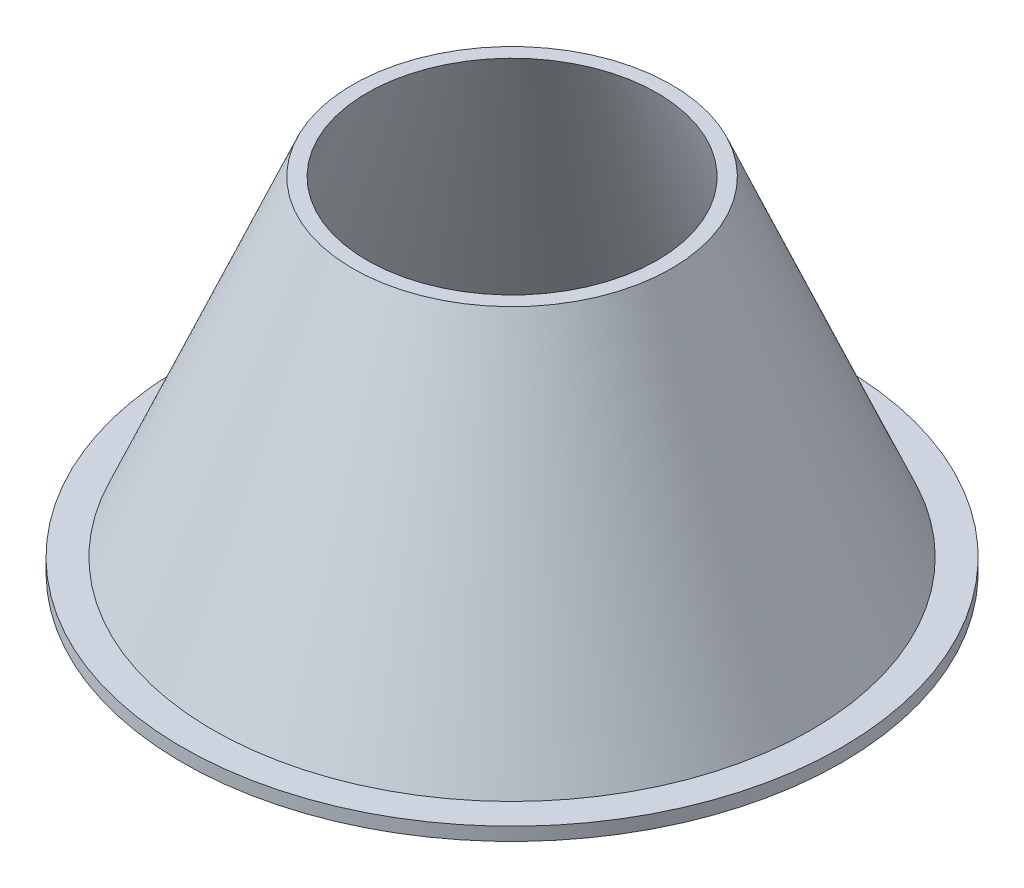
ISO-10303-21;
HEADER;
FILE_DESCRIPTION(('STEP AP214'),'2;1');
FILE_NAME('part.step','',(''),(''),'','','');
FILE_SCHEMA(('AUTOMOTIVE_DESIGN { 1 0 10303 214 1 1 1 1 }'));
ENDSEC;
DATA;
#1=APPLICATION_CONTEXT('core data for automotive mechanical design processes');
#2=APPLICATION_PROTOCOL_DEFINITION('international standard','automotive_design',2000,#1);
#3=PRODUCT_CONTEXT('',#1,'mechanical');
#4=PRODUCT('Part','Part','',(#3));
#5=PRODUCT_RELATED_PRODUCT_CATEGORY('part','',(#4));
#6=PRODUCT_DEFINITION_FORMATION('','',#4);
#7=PRODUCT_DEFINITION_CONTEXT('part definition',#1,'design');
#8=PRODUCT_DEFINITION('design','',#6,#7);
#9=PRODUCT_DEFINITION_SHAPE('','',#8);
#10=(LENGTH_UNIT() NAMED_UNIT(*) SI_UNIT(.MILLI.,.METRE.));
#11=(NAMED_UNIT(*) PLANE_ANGLE_UNIT() SI_UNIT($,.RADIAN.));
#12=(NAMED_UNIT(*) SI_UNIT($,.STERADIAN.) SOLID_ANGLE_UNIT());
#13=UNCERTAINTY_MEASURE_WITH_UNIT(LENGTH_MEASURE(1.E-05),#10,'distance_accuracy_value','');
#14=(GEOMETRIC_REPRESENTATION_CONTEXT(3) GLOBAL_UNCERTAINTY_ASSIGNED_CONTEXT((#13)) GLOBAL_UNIT_ASSIGNED_CONTEXT((#10,
#11,#12)) REPRESENTATION_CONTEXT('',''));
#15=CARTESIAN_POINT('',(0.,0.,0.));
#16=DIRECTION('',(0.,0.,1.));
#17=DIRECTION('',(1.,0.,0.));
#18=AXIS2_PLACEMENT_3D('',#15,#16,#17);
#19=CARTESIAN_POINT('',(-9.21833143574773,-10.8009520520653,0.));
#20=DIRECTION('',(0.,-1.,0.));
#21=DIRECTION('',(0.,0.,-1.));
#22=AXIS2_PLACEMENT_3D('',#19,#20,#21);
#23=PLANE('',#22);
#24=CARTESIAN_POINT('',(-32.7365040464726,-10.8009520545964,0.));
#25=DIRECTION('',(0.,-1.,0.));
#26=DIRECTION('',(1.,0.,0.));
#27=AXIS2_PLACEMENT_3D('',#24,#25,#26);
#28=CIRCLE('',#27,22.0363452154867);
#29=CARTESIAN_POINT('',(-10.7001588309859,-10.8009520545964,0.));
#30=VERTEX_POINT('',#29);
#31=EDGE_CURVE('E41',#30,#30,#28,.F.);
#32=ORIENTED_EDGE('',*,*,#31,.T.);
#33=EDGE_LOOP('',(#32));
#34=FACE_BOUND('',#33,.T.);
#35=CARTESIAN_POINT('',(-32.7365040464726,-10.8009520520653,0.));
#36=DIRECTION('',(0.,-1.,0.));
#37=DIRECTION('',(1.,0.,0.));
#38=AXIS2_PLACEMENT_3D('',#35,#36,#37);
#39=CIRCLE('',#38,25.);
#40=CARTESIAN_POINT('',(-7.73650404647259,-10.8009520520653,0.));
#41=VERTEX_POINT('',#40);
#42=EDGE_CURVE('E46',#41,#41,#39,.F.);
#43=ORIENTED_EDGE('',*,*,#42,.F.);
#44=EDGE_LOOP('',(#43));
#45=FACE_BOUND('',#44,.T.);
#46=ADVANCED_FACE('F15',(#34,#45),#23,.T.);
#47=CARTESIAN_POINT('',(-32.7365040464726,-10.3009520520653,0.));
#48=DIRECTION('',(0.,-1.,0.));
#49=DIRECTION('',(1.,0.,0.));
#50=AXIS2_PLACEMENT_3D('',#47,#48,#49);
#51=CYLINDRICAL_SURFACE('',#50,25.);
#52=CARTESIAN_POINT('',(-32.7365040464726,-9.80095205206527,0.));
#53=DIRECTION('',(0.,-1.,0.));
#54=DIRECTION('',(1.,0.,0.));
#55=AXIS2_PLACEMENT_3D('',#52,#53,#54);
#56=CIRCLE('',#55,25.);
#57=CARTESIAN_POINT('',(-7.73650404647259,-9.80095205206525,0.));
#58=VERTEX_POINT('',#57);
#59=EDGE_CURVE('E36',#58,#58,#56,.F.);
#60=ORIENTED_EDGE('',*,*,#59,.F.);
#61=EDGE_LOOP('',(#60));
#62=FACE_BOUND('',#61,.T.);
#63=ORIENTED_EDGE('',*,*,#42,.T.);
#64=EDGE_LOOP('',(#63));
#65=FACE_BOUND('',#64,.T.);
#66=ADVANCED_FACE('F51',(#62,#65),#51,.T.);
#67=CARTESIAN_POINT('',(-32.7365040464726,-10.8009520545964,0.));
#68=DIRECTION('',(0.,-1.,0.));
#69=DIRECTION('',(1.,0.,0.));
#70=AXIS2_PLACEMENT_3D('',#67,#68,#69);
#71=CONICAL_SURFACE('',#70,22.0363452154867,0.4014257275);
#72=ORIENTED_EDGE('',*,*,#31,.F.);
#73=EDGE_LOOP('',(#72));
#74=FACE_BOUND('',#73,.T.);
#75=CARTESIAN_POINT('',(-32.7365040464726,15.1990479504659,0.));
#76=DIRECTION('',(0.,-1.,0.));
#77=DIRECTION('',(1.,0.,0.));
#78=AXIS2_PLACEMENT_3D('',#75,#76,#77);
#79=CIRCLE('',#78,11.0000000059631);
#80=CARTESIAN_POINT('',(-21.7365040405095,15.1990479504659,0.));
#81=VERTEX_POINT('',#80);
#82=EDGE_CURVE('E27',#81,#81,#79,.T.);
#83=ORIENTED_EDGE('',*,*,#82,.F.);
#84=EDGE_LOOP('',(#83));
#85=FACE_BOUND('',#84,.T.);
#86=ADVANCED_FACE('F59',(#74,#85),#71,.F.);
#87=CARTESIAN_POINT('',(-8.88738865514988,-9.80095205206525,0.));
#88=DIRECTION('',(0.,1.,0.));
#89=DIRECTION('',(0.,0.,1.));
#90=AXIS2_PLACEMENT_3D('',#87,#88,#89);
#91=PLANE('',#90);
#92=CARTESIAN_POINT('',(-32.7365040464726,-9.80095205449908,0.));
#93=DIRECTION('',(0.,-1.,0.));
#94=DIRECTION('',(1.,0.,0.));
#95=AXIS2_PLACEMENT_3D('',#92,#93,#94);
#96=CIRCLE('',#95,22.6982307769117);
#97=CARTESIAN_POINT('',(-10.0382732695609,-9.80095205449906,0.));
#98=VERTEX_POINT('',#97);
#99=EDGE_CURVE('E22',#98,#98,#96,.F.);
#100=ORIENTED_EDGE('',*,*,#99,.F.);
#101=EDGE_LOOP('',(#100));
#102=FACE_BOUND('',#101,.T.);
#103=ORIENTED_EDGE('',*,*,#59,.T.);
#104=EDGE_LOOP('',(#103));
#105=FACE_BOUND('',#104,.T.);
#106=ADVANCED_FACE('F68',(#102,#105),#91,.T.);
#107=CARTESIAN_POINT('',(-21.19332385777,15.1990479479347,0.));
#108=DIRECTION('',(0.,1.,0.));
#109=DIRECTION('',(0.,0.,1.));
#110=AXIS2_PLACEMENT_3D('',#107,#108,#109);
#111=PLANE('',#110);
#112=ORIENTED_EDGE('',*,*,#82,.T.);
#113=EDGE_LOOP('',(#112));
#114=FACE_BOUND('',#113,.T.);
#115=CARTESIAN_POINT('',(-32.7365040464726,15.1990479503685,0.));
#116=DIRECTION('',(0.,-1.,0.));
#117=DIRECTION('',(1.,0.,0.));
#118=AXIS2_PLACEMENT_3D('',#115,#116,#117);
#119=CIRCLE('',#118,12.086360383139);
#120=CARTESIAN_POINT('',(-20.6501436633336,15.1990479503686,0.));
#121=VERTEX_POINT('',#120);
#122=EDGE_CURVE('E10',#121,#121,#119,.T.);
#123=ORIENTED_EDGE('',*,*,#122,.F.);
#124=EDGE_LOOP('',(#123));
#125=FACE_BOUND('',#124,.T.);
#126=ADVANCED_FACE('F63',(#114,#125),#111,.T.);
#127=CARTESIAN_POINT('',(-32.7365040464726,-9.80095205449907,0.));
#128=DIRECTION('',(0.,-1.,0.));
#129=DIRECTION('',(1.,0.,0.));
#130=AXIS2_PLACEMENT_3D('',#127,#128,#129);
#131=CONICAL_SURFACE('',#130,22.6982307769117,0.4014257275);
#132=ORIENTED_EDGE('',*,*,#122,.T.);
#133=EDGE_LOOP('',(#132));
#134=FACE_BOUND('',#133,.T.);
#135=ORIENTED_EDGE('',*,*,#99,.T.);
#136=EDGE_LOOP('',(#135));
#137=FACE_BOUND('',#136,.T.);
#138=ADVANCED_FACE('F61',(#134,#137),#131,.T.);
#139=CLOSED_SHELL('',(#46,#66,#86,#106,#126,#138));
#140=MANIFOLD_SOLID_BREP('B1',#139);
#141=ADVANCED_BREP_SHAPE_REPRESENTATION('',(#18,#140),#14);
#142=SHAPE_DEFINITION_REPRESENTATION(#9,#141);
ENDSEC;
END-ISO-10303-21;
